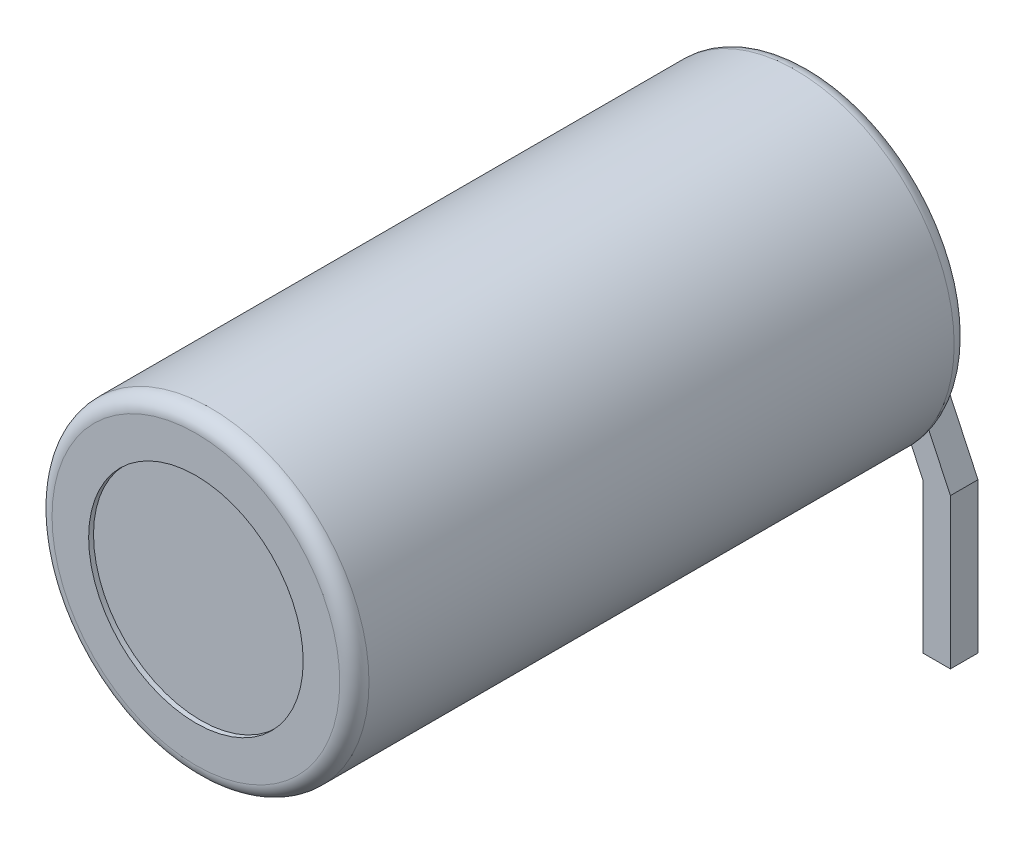
ISO-10303-21;
HEADER;
FILE_DESCRIPTION(('STEP AP214'),'2;1');
FILE_NAME('part.step','',(''),(''),'','','');
FILE_SCHEMA(('AUTOMOTIVE_DESIGN { 1 0 10303 214 1 1 1 1 }'));
ENDSEC;
DATA;
#1=APPLICATION_CONTEXT('core data for automotive mechanical design processes');
#2=APPLICATION_PROTOCOL_DEFINITION('international standard','automotive_design',2000,#1);
#3=PRODUCT_CONTEXT('',#1,'mechanical');
#4=PRODUCT('Part','Part','',(#3));
#5=PRODUCT_RELATED_PRODUCT_CATEGORY('part','',(#4));
#6=PRODUCT_DEFINITION_FORMATION('','',#4);
#7=PRODUCT_DEFINITION_CONTEXT('part definition',#1,'design');
#8=PRODUCT_DEFINITION('design','',#6,#7);
#9=PRODUCT_DEFINITION_SHAPE('','',#8);
#10=(LENGTH_UNIT() NAMED_UNIT(*) SI_UNIT(.MILLI.,.METRE.));
#11=(NAMED_UNIT(*) PLANE_ANGLE_UNIT() SI_UNIT($,.RADIAN.));
#12=(NAMED_UNIT(*) SI_UNIT($,.STERADIAN.) SOLID_ANGLE_UNIT());
#13=UNCERTAINTY_MEASURE_WITH_UNIT(LENGTH_MEASURE(1.E-05),#10,'distance_accuracy_value','');
#14=(GEOMETRIC_REPRESENTATION_CONTEXT(3) GLOBAL_UNCERTAINTY_ASSIGNED_CONTEXT((#13)) GLOBAL_UNIT_ASSIGNED_CONTEXT((#10,
#11,#12)) REPRESENTATION_CONTEXT('',''));
#15=CARTESIAN_POINT('',(0.,0.,0.));
#16=DIRECTION('',(0.,0.,1.));
#17=DIRECTION('',(1.,0.,0.));
#18=AXIS2_PLACEMENT_3D('',#15,#16,#17);
#19=CARTESIAN_POINT('',(-1.217,2.5,-7.71644487630317));
#20=DIRECTION('',(0.,1.,0.));
#21=DIRECTION('',(-1.,0.,0.));
#22=AXIS2_PLACEMENT_3D('',#19,#20,#21);
#23=PLANE('',#22);
#24=DIRECTION('',(-1.,0.,0.));
#25=VECTOR('',#24,1.);
#26=CARTESIAN_POINT('',(0.,2.5,-6.35));
#27=LINE('',#26,#25);
#28=CARTESIAN_POINT('',(-1.217,2.5,-6.35));
#29=VERTEX_POINT('',#28);
#30=CARTESIAN_POINT('',(-1.783,2.5,-6.35));
#31=VERTEX_POINT('',#30);
#32=EDGE_CURVE('E226',#29,#31,#27,.T.);
#33=ORIENTED_EDGE('',*,*,#32,.F.);
#34=DIRECTION('',(0.,0.,1.));
#35=VECTOR('',#34,1.);
#36=CARTESIAN_POINT('',(-1.217,2.5,-7.71644487630317));
#37=LINE('',#36,#35);
#38=CARTESIAN_POINT('',(-1.217,2.5,-6.2));
#39=VERTEX_POINT('',#38);
#40=EDGE_CURVE('E242',#29,#39,#37,.T.);
#41=ORIENTED_EDGE('',*,*,#40,.T.);
#42=DIRECTION('',(-1.,0.,0.));
#43=VECTOR('',#42,1.);
#44=CARTESIAN_POINT('',(-1.217,2.5,-6.2));
#45=LINE('',#44,#43);
#46=CARTESIAN_POINT('',(-1.783,2.5,-6.2));
#47=VERTEX_POINT('',#46);
#48=EDGE_CURVE('E234',#39,#47,#45,.T.);
#49=ORIENTED_EDGE('',*,*,#48,.T.);
#50=DIRECTION('',(0.,0.,1.));
#51=VECTOR('',#50,1.);
#52=CARTESIAN_POINT('',(-1.783,2.5,-7.71644487630317));
#53=LINE('',#52,#51);
#54=EDGE_CURVE('E209',#31,#47,#53,.T.);
#55=ORIENTED_EDGE('',*,*,#54,.F.);
#56=EDGE_LOOP('',(#33,#41,#49,#55));
#57=FACE_BOUND('',#56,.T.);
#58=ADVANCED_FACE('F46',(#57),#23,.F.);
#59=CARTESIAN_POINT('',(0.,0.,-6.2));
#60=DIRECTION('',(0.,0.,1.));
#61=DIRECTION('',(1.,0.,0.));
#62=AXIS2_PLACEMENT_3D('',#59,#60,#61);
#63=PLANE('',#62);
#64=DIRECTION('',(0.,1.,0.));
#65=VECTOR('',#64,1.);
#66=CARTESIAN_POINT('',(1.217,3.066,-6.2));
#67=LINE('',#66,#65);
#68=CARTESIAN_POINT('',(1.217,2.5,-6.2));
#69=VERTEX_POINT('',#68);
#70=CARTESIAN_POINT('',(1.217,3.066,-6.2));
#71=VERTEX_POINT('',#70);
#72=EDGE_CURVE('E306',#69,#71,#67,.T.);
#73=ORIENTED_EDGE('',*,*,#72,.F.);
#74=DIRECTION('',(-1.,0.,0.));
#75=VECTOR('',#74,1.);
#76=CARTESIAN_POINT('',(1.783,2.5,-6.2));
#77=LINE('',#76,#75);
#78=CARTESIAN_POINT('',(1.783,2.5,-6.2));
#79=VERTEX_POINT('',#78);
#80=EDGE_CURVE('E292',#79,#69,#77,.T.);
#81=ORIENTED_EDGE('',*,*,#80,.F.);
#82=DIRECTION('',(0.,-1.,0.));
#83=VECTOR('',#82,1.);
#84=CARTESIAN_POINT('',(1.783,3.066,-6.2));
#85=LINE('',#84,#83);
#86=CARTESIAN_POINT('',(1.783,3.066,-6.2));
#87=VERTEX_POINT('',#86);
#88=EDGE_CURVE('E297',#87,#79,#85,.T.);
#89=ORIENTED_EDGE('',*,*,#88,.F.);
#90=DIRECTION('',(1.,0.,0.));
#91=VECTOR('',#90,1.);
#92=CARTESIAN_POINT('',(1.783,3.066,-6.2));
#93=LINE('',#92,#91);
#94=EDGE_CURVE('E302',#71,#87,#93,.T.);
#95=ORIENTED_EDGE('',*,*,#94,.F.);
#96=EDGE_LOOP('',(#73,#81,#89,#95));
#97=FACE_BOUND('',#96,.T.);
#98=CARTESIAN_POINT('',(0.,3.35,-6.2));
#99=DIRECTION('',(0.,0.,1.));
#100=DIRECTION('',(1.,0.,0.));
#101=AXIS2_PLACEMENT_3D('',#98,#99,#100);
#102=CIRCLE('',#101,2.95);
#103=CARTESIAN_POINT('',(2.95,3.35,-6.2));
#104=VERTEX_POINT('',#103);
#105=EDGE_CURVE('E331',#104,#104,#102,.T.);
#106=ORIENTED_EDGE('',*,*,#105,.F.);
#107=EDGE_LOOP('',(#106));
#108=FACE_BOUND('',#107,.T.);
#109=DIRECTION('',(0.,1.,0.));
#110=VECTOR('',#109,1.);
#111=CARTESIAN_POINT('',(-1.783,3.066,-6.2));
#112=LINE('',#111,#110);
#113=CARTESIAN_POINT('',(-1.783,3.066,-6.2));
#114=VERTEX_POINT('',#113);
#115=EDGE_CURVE('E248',#47,#114,#112,.T.);
#116=ORIENTED_EDGE('',*,*,#115,.F.);
#117=ORIENTED_EDGE('',*,*,#48,.F.);
#118=DIRECTION('',(0.,-1.,0.));
#119=VECTOR('',#118,1.);
#120=CARTESIAN_POINT('',(-1.217,3.066,-6.2));
#121=LINE('',#120,#119);
#122=CARTESIAN_POINT('',(-1.217,3.066,-6.2));
#123=VERTEX_POINT('',#122);
#124=EDGE_CURVE('E239',#123,#39,#121,.T.);
#125=ORIENTED_EDGE('',*,*,#124,.F.);
#126=DIRECTION('',(1.,0.,0.));
#127=VECTOR('',#126,1.);
#128=CARTESIAN_POINT('',(-1.217,3.066,-6.2));
#129=LINE('',#128,#127);
#130=EDGE_CURVE('E244',#114,#123,#129,.T.);
#131=ORIENTED_EDGE('',*,*,#130,.F.);
#132=EDGE_LOOP('',(#116,#117,#125,#131));
#133=FACE_BOUND('',#132,.T.);
#134=ADVANCED_FACE('F419',(#97,#108,#133),#63,.F.);
#135=CARTESIAN_POINT('',(1.783,2.5,-7.71644487630317));
#136=DIRECTION('',(0.,1.,0.));
#137=DIRECTION('',(-1.,0.,0.));
#138=AXIS2_PLACEMENT_3D('',#135,#136,#137);
#139=PLANE('',#138);
#140=DIRECTION('',(1.,0.,0.));
#141=VECTOR('',#140,1.);
#142=CARTESIAN_POINT('',(0.,2.5,-6.35));
#143=LINE('',#142,#141);
#144=CARTESIAN_POINT('',(1.217,2.5,-6.35));
#145=VERTEX_POINT('',#144);
#146=CARTESIAN_POINT('',(1.783,2.5,-6.35));
#147=VERTEX_POINT('',#146);
#148=EDGE_CURVE('E268',#145,#147,#143,.T.);
#149=ORIENTED_EDGE('',*,*,#148,.T.);
#150=DIRECTION('',(0.,0.,1.));
#151=VECTOR('',#150,1.);
#152=CARTESIAN_POINT('',(1.783,2.5,-7.71644487630317));
#153=LINE('',#152,#151);
#154=EDGE_CURVE('E300',#147,#79,#153,.T.);
#155=ORIENTED_EDGE('',*,*,#154,.T.);
#156=ORIENTED_EDGE('',*,*,#80,.T.);
#157=DIRECTION('',(0.,0.,1.));
#158=VECTOR('',#157,1.);
#159=CARTESIAN_POINT('',(1.217,2.5,-7.71644487630317));
#160=LINE('',#159,#158);
#161=EDGE_CURVE('E291',#145,#69,#160,.T.);
#162=ORIENTED_EDGE('',*,*,#161,.F.);
#163=EDGE_LOOP('',(#149,#155,#156,#162));
#164=FACE_BOUND('',#163,.T.);
#165=ADVANCED_FACE('F425',(#164),#139,.F.);
#166=CARTESIAN_POINT('',(0.,3.35,8.51058328321347));
#167=DIRECTION('',(0.,0.,1.));
#168=DIRECTION('',(1.,0.,0.));
#169=AXIS2_PLACEMENT_3D('',#166,#167,#168);
#170=CYLINDRICAL_SURFACE('',#169,3.15);
#171=CARTESIAN_POINT('',(0.,3.35,-6.));
#172=DIRECTION('',(0.,0.,1.));
#173=DIRECTION('',(1.,0.,0.));
#174=AXIS2_PLACEMENT_3D('',#171,#172,#173);
#175=CIRCLE('',#174,3.15);
#176=CARTESIAN_POINT('',(3.15,3.35,-6.));
#177=VERTEX_POINT('',#176);
#178=EDGE_CURVE('E334',#177,#177,#175,.T.);
#179=ORIENTED_EDGE('',*,*,#178,.T.);
#180=EDGE_LOOP('',(#179));
#181=FACE_BOUND('',#180,.T.);
#182=CARTESIAN_POINT('',(0.,3.35,6.));
#183=DIRECTION('',(0.,0.,1.));
#184=DIRECTION('',(1.,0.,0.));
#185=AXIS2_PLACEMENT_3D('',#182,#183,#184);
#186=CIRCLE('',#185,3.15);
#187=CARTESIAN_POINT('',(3.15,3.35,6.));
#188=VERTEX_POINT('',#187);
#189=EDGE_CURVE('E313',#188,#188,#186,.T.);
#190=ORIENTED_EDGE('',*,*,#189,.F.);
#191=EDGE_LOOP('',(#190));
#192=FACE_BOUND('',#191,.T.);
#193=ADVANCED_FACE('F471',(#181,#192),#170,.T.);
#194=CARTESIAN_POINT('',(0.,3.35,-6.));
#195=DIRECTION('',(0.,0.,1.));
#196=DIRECTION('',(1.,0.,0.));
#197=AXIS2_PLACEMENT_3D('',#194,#195,#196);
#198=TOROIDAL_SURFACE('',#197,2.95,0.2);
#199=ORIENTED_EDGE('',*,*,#105,.T.);
#200=EDGE_LOOP('',(#199));
#201=FACE_BOUND('',#200,.T.);
#202=ORIENTED_EDGE('',*,*,#178,.F.);
#203=EDGE_LOOP('',(#202));
#204=FACE_BOUND('',#203,.T.);
#205=ADVANCED_FACE('F494',(#201,#204),#198,.T.);
#206=CARTESIAN_POINT('',(0.,0.,6.2));
#207=DIRECTION('',(0.,0.,1.));
#208=DIRECTION('',(1.,0.,0.));
#209=AXIS2_PLACEMENT_3D('',#206,#207,#208);
#210=PLANE('',#209);
#211=CARTESIAN_POINT('',(0.,3.35,6.2));
#212=DIRECTION('',(0.,0.,1.));
#213=DIRECTION('',(1.,0.,0.));
#214=AXIS2_PLACEMENT_3D('',#211,#212,#213);
#215=CIRCLE('',#214,2.95);
#216=CARTESIAN_POINT('',(2.95,3.35,6.2));
#217=VERTEX_POINT('',#216);
#218=EDGE_CURVE('E328',#217,#217,#215,.T.);
#219=ORIENTED_EDGE('',*,*,#218,.T.);
#220=EDGE_LOOP('',(#219));
#221=FACE_BOUND('',#220,.T.);
#222=ADVANCED_FACE('F491',(#221),#210,.T.);
#223=CARTESIAN_POINT('',(0.,3.35,6.));
#224=DIRECTION('',(0.,0.,1.));
#225=DIRECTION('',(1.,0.,0.));
#226=AXIS2_PLACEMENT_3D('',#223,#224,#225);
#227=TOROIDAL_SURFACE('',#226,2.95,0.2);
#228=ORIENTED_EDGE('',*,*,#218,.F.);
#229=EDGE_LOOP('',(#228));
#230=FACE_BOUND('',#229,.T.);
#231=ORIENTED_EDGE('',*,*,#189,.T.);
#232=EDGE_LOOP('',(#231));
#233=FACE_BOUND('',#232,.T.);
#234=ADVANCED_FACE('F484',(#230,#233),#227,.T.);
#235=CARTESIAN_POINT('',(1.217,3.066,-7.71644487630317));
#236=DIRECTION('',(1.,0.,0.));
#237=DIRECTION('',(0.,0.,-1.));
#238=AXIS2_PLACEMENT_3D('',#235,#236,#237);
#239=PLANE('',#238);
#240=DIRECTION('',(0.,1.,0.));
#241=VECTOR('',#240,1.);
#242=CARTESIAN_POINT('',(1.217,3.066,-6.916));
#243=LINE('',#242,#241);
#244=CARTESIAN_POINT('',(1.217,2.5,-6.916));
#245=VERTEX_POINT('',#244);
#246=CARTESIAN_POINT('',(1.217,3.066,-6.916));
#247=VERTEX_POINT('',#246);
#248=EDGE_CURVE('E295',#245,#247,#243,.T.);
#249=ORIENTED_EDGE('',*,*,#248,.F.);
#250=EDGE_CURVE('E309',#245,#145,#160,.T.);
#251=ORIENTED_EDGE('',*,*,#250,.T.);
#252=ORIENTED_EDGE('',*,*,#161,.T.);
#253=ORIENTED_EDGE('',*,*,#72,.T.);
#254=DIRECTION('',(0.,0.,1.));
#255=VECTOR('',#254,1.);
#256=CARTESIAN_POINT('',(1.217,3.066,-7.71644487630317));
#257=LINE('',#256,#255);
#258=EDGE_CURVE('E305',#247,#71,#257,.T.);
#259=ORIENTED_EDGE('',*,*,#258,.F.);
#260=EDGE_LOOP('',(#249,#251,#252,#253,#259));
#261=FACE_BOUND('',#260,.T.);
#262=ADVANCED_FACE('F480',(#261),#239,.F.);
#263=CARTESIAN_POINT('',(1.783,3.066,-7.71644487630317));
#264=DIRECTION('',(0.,-1.,0.));
#265=DIRECTION('',(0.,0.,-1.));
#266=AXIS2_PLACEMENT_3D('',#263,#264,#265);
#267=PLANE('',#266);
#268=DIRECTION('',(1.,0.,0.));
#269=VECTOR('',#268,1.);
#270=CARTESIAN_POINT('',(1.783,3.066,-6.916));
#271=LINE('',#270,#269);
#272=CARTESIAN_POINT('',(1.783,3.066,-6.916));
#273=VERTEX_POINT('',#272);
#274=EDGE_CURVE('E314',#247,#273,#271,.T.);
#275=ORIENTED_EDGE('',*,*,#274,.F.);
#276=ORIENTED_EDGE('',*,*,#258,.T.);
#277=ORIENTED_EDGE('',*,*,#94,.T.);
#278=DIRECTION('',(0.,0.,1.));
#279=VECTOR('',#278,1.);
#280=CARTESIAN_POINT('',(1.783,3.066,-7.71644487630317));
#281=LINE('',#280,#279);
#282=EDGE_CURVE('E301',#273,#87,#281,.T.);
#283=ORIENTED_EDGE('',*,*,#282,.F.);
#284=EDGE_LOOP('',(#275,#276,#277,#283));
#285=FACE_BOUND('',#284,.T.);
#286=ADVANCED_FACE('F476',(#285),#267,.F.);
#287=CARTESIAN_POINT('',(1.783,3.066,-7.71644487630317));
#288=DIRECTION('',(-1.,0.,0.));
#289=DIRECTION('',(0.,0.,1.));
#290=AXIS2_PLACEMENT_3D('',#287,#288,#289);
#291=PLANE('',#290);
#292=DIRECTION('',(0.,-1.,0.));
#293=VECTOR('',#292,1.);
#294=CARTESIAN_POINT('',(1.783,3.066,-6.916));
#295=LINE('',#294,#293);
#296=CARTESIAN_POINT('',(1.783,2.5,-6.916));
#297=VERTEX_POINT('',#296);
#298=EDGE_CURVE('E310',#273,#297,#295,.T.);
#299=ORIENTED_EDGE('',*,*,#298,.F.);
#300=ORIENTED_EDGE('',*,*,#282,.T.);
#301=ORIENTED_EDGE('',*,*,#88,.T.);
#302=ORIENTED_EDGE('',*,*,#154,.F.);
#303=EDGE_CURVE('E296',#297,#147,#153,.T.);
#304=ORIENTED_EDGE('',*,*,#303,.F.);
#305=EDGE_LOOP('',(#299,#300,#301,#302,#304));
#306=FACE_BOUND('',#305,.T.);
#307=ADVANCED_FACE('F473',(#306),#291,.F.);
#308=CARTESIAN_POINT('',(0.,0.,-6.916));
#309=DIRECTION('',(0.,0.,-1.));
#310=DIRECTION('',(-1.,0.,0.));
#311=AXIS2_PLACEMENT_3D('',#308,#309,#310);
#312=PLANE('',#311);
#313=DIRECTION('',(0.,1.,0.));
#314=VECTOR('',#313,1.);
#315=CARTESIAN_POINT('',(2.823,0.,-6.916));
#316=LINE('',#315,#314);
#317=CARTESIAN_POINT('',(2.823,-2.8,-6.916));
#318=VERTEX_POINT('',#317);
#319=CARTESIAN_POINT('',(2.823,0.278543307086614,-6.916));
#320=VERTEX_POINT('',#319);
#321=EDGE_CURVE('E267',#318,#320,#316,.T.);
#322=ORIENTED_EDGE('',*,*,#321,.F.);
#323=DIRECTION('',(-1.,0.,0.));
#324=VECTOR('',#323,1.);
#325=CARTESIAN_POINT('',(2.257,-2.8,-6.916));
#326=LINE('',#325,#324);
#327=CARTESIAN_POINT('',(2.257,-2.8,-6.916));
#328=VERTEX_POINT('',#327);
#329=EDGE_CURVE('E349',#318,#328,#326,.T.);
#330=ORIENTED_EDGE('',*,*,#329,.T.);
#331=DIRECTION('',(0.,1.,0.));
#332=VECTOR('',#331,1.);
#333=CARTESIAN_POINT('',(2.257,0.,-6.916));
#334=LINE('',#333,#332);
#335=CARTESIAN_POINT('',(2.257,0.278543307086616,-6.916));
#336=VERTEX_POINT('',#335);
#337=EDGE_CURVE('E270',#328,#336,#334,.T.);
#338=ORIENTED_EDGE('',*,*,#337,.T.);
#339=DIRECTION('',(-0.423996691128716,0.905663737770206,0.));
#340=VECTOR('',#339,1.);
#341=CARTESIAN_POINT('',(1.95821209301936,0.916759072205575,-6.916));
#342=LINE('',#341,#340);
#343=EDGE_CURVE('E272',#336,#245,#342,.T.);
#344=ORIENTED_EDGE('',*,*,#343,.T.);
#345=ORIENTED_EDGE('',*,*,#248,.T.);
#346=ORIENTED_EDGE('',*,*,#274,.T.);
#347=ORIENTED_EDGE('',*,*,#298,.T.);
#348=DIRECTION('',(-0.423996691128715,0.905663737770206,0.));
#349=VECTOR('',#348,1.);
#350=CARTESIAN_POINT('',(2.4224604651655,1.13410218250442,-6.916));
#351=LINE('',#350,#349);
#352=EDGE_CURVE('E265',#320,#297,#351,.T.);
#353=ORIENTED_EDGE('',*,*,#352,.F.);
#354=EDGE_LOOP('',(#322,#330,#338,#344,#345,#346,#347,#353));
#355=FACE_BOUND('',#354,.T.);
#356=ADVANCED_FACE('F467',(#355),#312,.T.);
#357=CARTESIAN_POINT('',(2.4224604651655,1.13410218250442,-6.916));
#358=DIRECTION('',(0.905663737770206,0.423996691128715,0.));
#359=DIRECTION('',(-0.423996691128715,0.905663737770206,0.));
#360=AXIS2_PLACEMENT_3D('',#357,#358,#359);
#361=PLANE('',#360);
#362=DIRECTION('',(-0.423996691128715,0.905663737770206,0.));
#363=VECTOR('',#362,1.);
#364=CARTESIAN_POINT('',(2.4224604651655,1.13410218250442,-6.35));
#365=LINE('',#364,#363);
#366=CARTESIAN_POINT('',(2.823,0.278543307086614,-6.35));
#367=VERTEX_POINT('',#366);
#368=EDGE_CURVE('E254',#367,#147,#365,.T.);
#369=ORIENTED_EDGE('',*,*,#368,.F.);
#370=DIRECTION('',(0.,0.,1.));
#371=VECTOR('',#370,1.);
#372=CARTESIAN_POINT('',(2.823,0.278543307086614,-6.916));
#373=LINE('',#372,#371);
#374=EDGE_CURVE('E288',#320,#367,#373,.T.);
#375=ORIENTED_EDGE('',*,*,#374,.F.);
#376=ORIENTED_EDGE('',*,*,#352,.T.);
#377=ORIENTED_EDGE('',*,*,#303,.T.);
#378=EDGE_LOOP('',(#369,#375,#376,#377));
#379=FACE_BOUND('',#378,.T.);
#380=ADVANCED_FACE('F463',(#379),#361,.T.);
#381=CARTESIAN_POINT('',(2.823,0.,-6.916));
#382=DIRECTION('',(1.,0.,0.));
#383=DIRECTION('',(0.,1.,0.));
#384=AXIS2_PLACEMENT_3D('',#381,#382,#383);
#385=PLANE('',#384);
#386=DIRECTION('',(0.,1.,0.));
#387=VECTOR('',#386,1.);
#388=CARTESIAN_POINT('',(2.823,0.,-6.35));
#389=LINE('',#388,#387);
#390=CARTESIAN_POINT('',(2.823,-2.8,-6.35));
#391=VERTEX_POINT('',#390);
#392=EDGE_CURVE('E278',#391,#367,#389,.T.);
#393=ORIENTED_EDGE('',*,*,#392,.F.);
#394=DIRECTION('',(0.,0.,-1.));
#395=VECTOR('',#394,1.);
#396=CARTESIAN_POINT('',(2.823,-2.8,-6.916));
#397=LINE('',#396,#395);
#398=EDGE_CURVE('E346',#391,#318,#397,.T.);
#399=ORIENTED_EDGE('',*,*,#398,.T.);
#400=ORIENTED_EDGE('',*,*,#321,.T.);
#401=ORIENTED_EDGE('',*,*,#374,.T.);
#402=EDGE_LOOP('',(#393,#399,#400,#401));
#403=FACE_BOUND('',#402,.T.);
#404=ADVANCED_FACE('F459',(#403),#385,.T.);
#405=CARTESIAN_POINT('',(0.,-3.,-6.916));
#406=DIRECTION('',(0.,1.,0.));
#407=DIRECTION('',(0.,0.,1.));
#408=AXIS2_PLACEMENT_3D('',#405,#406,#407);
#409=PLANE('',#408);
#410=DIRECTION('',(1.,0.,0.));
#411=VECTOR('',#410,1.);
#412=CARTESIAN_POINT('',(2.823,-3.,-6.716));
#413=LINE('',#412,#411);
#414=CARTESIAN_POINT('',(2.457,-3.,-6.716));
#415=VERTEX_POINT('',#414);
#416=CARTESIAN_POINT('',(2.623,-3.,-6.716));
#417=VERTEX_POINT('',#416);
#418=EDGE_CURVE('E341',#415,#417,#413,.T.);
#419=ORIENTED_EDGE('',*,*,#418,.T.);
#420=DIRECTION('',(0.,0.,1.));
#421=VECTOR('',#420,1.);
#422=CARTESIAN_POINT('',(2.623,-3.,-6.35));
#423=LINE('',#422,#421);
#424=CARTESIAN_POINT('',(2.623,-3.,-6.55));
#425=VERTEX_POINT('',#424);
#426=EDGE_CURVE('E343',#417,#425,#423,.T.);
#427=ORIENTED_EDGE('',*,*,#426,.T.);
#428=DIRECTION('',(-1.,0.,0.));
#429=VECTOR('',#428,1.);
#430=CARTESIAN_POINT('',(0.,-3.,-6.55));
#431=LINE('',#430,#429);
#432=CARTESIAN_POINT('',(2.457,-3.,-6.55));
#433=VERTEX_POINT('',#432);
#434=EDGE_CURVE('E337',#425,#433,#431,.T.);
#435=ORIENTED_EDGE('',*,*,#434,.T.);
#436=DIRECTION('',(0.,0.,-1.));
#437=VECTOR('',#436,1.);
#438=CARTESIAN_POINT('',(2.457,-3.,-6.916));
#439=LINE('',#438,#437);
#440=EDGE_CURVE('E339',#433,#415,#439,.T.);
#441=ORIENTED_EDGE('',*,*,#440,.T.);
#442=EDGE_LOOP('',(#419,#427,#435,#441));
#443=FACE_BOUND('',#442,.T.);
#444=ADVANCED_FACE('F455',(#443),#409,.F.);
#445=CARTESIAN_POINT('',(2.257,0.,-6.916));
#446=DIRECTION('',(1.,0.,0.));
#447=DIRECTION('',(0.,0.,-1.));
#448=AXIS2_PLACEMENT_3D('',#445,#446,#447);
#449=PLANE('',#448);
#450=ORIENTED_EDGE('',*,*,#337,.F.);
#451=DIRECTION('',(0.,0.,1.));
#452=VECTOR('',#451,1.);
#453=CARTESIAN_POINT('',(2.257,-2.8,-6.916));
#454=LINE('',#453,#452);
#455=CARTESIAN_POINT('',(2.257,-2.8,-6.35));
#456=VERTEX_POINT('',#455);
#457=EDGE_CURVE('E351',#328,#456,#454,.T.);
#458=ORIENTED_EDGE('',*,*,#457,.T.);
#459=DIRECTION('',(0.,1.,0.));
#460=VECTOR('',#459,1.);
#461=CARTESIAN_POINT('',(2.257,0.,-6.35));
#462=LINE('',#461,#460);
#463=CARTESIAN_POINT('',(2.257,0.278543307086616,-6.35));
#464=VERTEX_POINT('',#463);
#465=EDGE_CURVE('E280',#456,#464,#462,.T.);
#466=ORIENTED_EDGE('',*,*,#465,.T.);
#467=DIRECTION('',(0.,0.,1.));
#468=VECTOR('',#467,1.);
#469=CARTESIAN_POINT('',(2.257,0.278543307086616,-6.916));
#470=LINE('',#469,#468);
#471=EDGE_CURVE('E275',#336,#464,#470,.T.);
#472=ORIENTED_EDGE('',*,*,#471,.F.);
#473=EDGE_LOOP('',(#450,#458,#466,#472));
#474=FACE_BOUND('',#473,.T.);
#475=ADVANCED_FACE('F451',(#474),#449,.F.);
#476=CARTESIAN_POINT('',(1.95821209301936,0.916759072205575,-6.916));
#477=DIRECTION('',(0.905663737770206,0.423996691128716,0.));
#478=DIRECTION('',(-0.423996691128716,0.905663737770206,0.));
#479=AXIS2_PLACEMENT_3D('',#476,#477,#478);
#480=PLANE('',#479);
#481=DIRECTION('',(-0.423996691128716,0.905663737770206,0.));
#482=VECTOR('',#481,1.);
#483=CARTESIAN_POINT('',(1.95821209301936,0.916759072205575,-6.35));
#484=LINE('',#483,#482);
#485=EDGE_CURVE('E282',#464,#145,#484,.T.);
#486=ORIENTED_EDGE('',*,*,#485,.T.);
#487=ORIENTED_EDGE('',*,*,#250,.F.);
#488=ORIENTED_EDGE('',*,*,#343,.F.);
#489=ORIENTED_EDGE('',*,*,#471,.T.);
#490=EDGE_LOOP('',(#486,#487,#488,#489));
#491=FACE_BOUND('',#490,.T.);
#492=ADVANCED_FACE('F447',(#491),#480,.F.);
#493=CARTESIAN_POINT('',(0.,0.,-6.35));
#494=DIRECTION('',(0.,0.,-1.));
#495=DIRECTION('',(-1.,0.,0.));
#496=AXIS2_PLACEMENT_3D('',#493,#494,#495);
#497=PLANE('',#496);
#498=ORIENTED_EDGE('',*,*,#465,.F.);
#499=DIRECTION('',(1.,0.,0.));
#500=VECTOR('',#499,1.);
#501=CARTESIAN_POINT('',(0.,-2.8,-6.35));
#502=LINE('',#501,#500);
#503=EDGE_CURVE('E353',#456,#391,#502,.T.);
#504=ORIENTED_EDGE('',*,*,#503,.T.);
#505=ORIENTED_EDGE('',*,*,#392,.T.);
#506=ORIENTED_EDGE('',*,*,#368,.T.);
#507=ORIENTED_EDGE('',*,*,#148,.F.);
#508=ORIENTED_EDGE('',*,*,#485,.F.);
#509=EDGE_LOOP('',(#498,#504,#505,#506,#507,#508));
#510=FACE_BOUND('',#509,.T.);
#511=ADVANCED_FACE('F441',(#510),#497,.F.);
#512=CARTESIAN_POINT('',(-1.783,3.066,-7.71644487630317));
#513=DIRECTION('',(1.,0.,0.));
#514=DIRECTION('',(0.,0.,-1.));
#515=AXIS2_PLACEMENT_3D('',#512,#513,#514);
#516=PLANE('',#515);
#517=DIRECTION('',(0.,1.,0.));
#518=VECTOR('',#517,1.);
#519=CARTESIAN_POINT('',(-1.783,3.066,-6.916));
#520=LINE('',#519,#518);
#521=CARTESIAN_POINT('',(-1.783,2.5,-6.916));
#522=VERTEX_POINT('',#521);
#523=CARTESIAN_POINT('',(-1.783,3.066,-6.916));
#524=VERTEX_POINT('',#523);
#525=EDGE_CURVE('E237',#522,#524,#520,.T.);
#526=ORIENTED_EDGE('',*,*,#525,.F.);
#527=EDGE_CURVE('E214',#522,#31,#53,.T.);
#528=ORIENTED_EDGE('',*,*,#527,.T.);
#529=ORIENTED_EDGE('',*,*,#54,.T.);
#530=ORIENTED_EDGE('',*,*,#115,.T.);
#531=DIRECTION('',(0.,0.,1.));
#532=VECTOR('',#531,1.);
#533=CARTESIAN_POINT('',(-1.783,3.066,-7.71644487630317));
#534=LINE('',#533,#532);
#535=EDGE_CURVE('E247',#524,#114,#534,.T.);
#536=ORIENTED_EDGE('',*,*,#535,.F.);
#537=EDGE_LOOP('',(#526,#528,#529,#530,#536));
#538=FACE_BOUND('',#537,.T.);
#539=ADVANCED_FACE('F437',(#538),#516,.F.);
#540=CARTESIAN_POINT('',(-1.217,3.066,-7.71644487630317));
#541=DIRECTION('',(0.,-1.,0.));
#542=DIRECTION('',(0.,0.,-1.));
#543=AXIS2_PLACEMENT_3D('',#540,#541,#542);
#544=PLANE('',#543);
#545=DIRECTION('',(1.,0.,0.));
#546=VECTOR('',#545,1.);
#547=CARTESIAN_POINT('',(-1.217,3.066,-6.916));
#548=LINE('',#547,#546);
#549=CARTESIAN_POINT('',(-1.217,3.066,-6.916));
#550=VERTEX_POINT('',#549);
#551=EDGE_CURVE('E255',#524,#550,#548,.T.);
#552=ORIENTED_EDGE('',*,*,#551,.F.);
#553=ORIENTED_EDGE('',*,*,#535,.T.);
#554=ORIENTED_EDGE('',*,*,#130,.T.);
#555=DIRECTION('',(0.,0.,1.));
#556=VECTOR('',#555,1.);
#557=CARTESIAN_POINT('',(-1.217,3.066,-7.71644487630317));
#558=LINE('',#557,#556);
#559=EDGE_CURVE('E243',#550,#123,#558,.T.);
#560=ORIENTED_EDGE('',*,*,#559,.F.);
#561=EDGE_LOOP('',(#552,#553,#554,#560));
#562=FACE_BOUND('',#561,.T.);
#563=ADVANCED_FACE('F433',(#562),#544,.F.);
#564=CARTESIAN_POINT('',(-1.217,3.066,-7.71644487630317));
#565=DIRECTION('',(-1.,0.,0.));
#566=DIRECTION('',(0.,-1.,0.));
#567=AXIS2_PLACEMENT_3D('',#564,#565,#566);
#568=PLANE('',#567);
#569=DIRECTION('',(0.,-1.,0.));
#570=VECTOR('',#569,1.);
#571=CARTESIAN_POINT('',(-1.217,3.066,-6.916));
#572=LINE('',#571,#570);
#573=CARTESIAN_POINT('',(-1.217,2.5,-6.916));
#574=VERTEX_POINT('',#573);
#575=EDGE_CURVE('E251',#550,#574,#572,.T.);
#576=ORIENTED_EDGE('',*,*,#575,.F.);
#577=ORIENTED_EDGE('',*,*,#559,.T.);
#578=ORIENTED_EDGE('',*,*,#124,.T.);
#579=ORIENTED_EDGE('',*,*,#40,.F.);
#580=EDGE_CURVE('E238',#574,#29,#37,.T.);
#581=ORIENTED_EDGE('',*,*,#580,.F.);
#582=EDGE_LOOP('',(#576,#577,#578,#579,#581));
#583=FACE_BOUND('',#582,.T.);
#584=ADVANCED_FACE('F430',(#583),#568,.F.);
#585=CARTESIAN_POINT('',(0.,0.,-6.916));
#586=DIRECTION('',(0.,0.,-1.));
#587=DIRECTION('',(-1.,0.,0.));
#588=AXIS2_PLACEMENT_3D('',#585,#586,#587);
#589=PLANE('',#588);
#590=DIRECTION('',(0.,1.,0.));
#591=VECTOR('',#590,1.);
#592=CARTESIAN_POINT('',(-2.257,0.,-6.916));
#593=LINE('',#592,#591);
#594=CARTESIAN_POINT('',(-2.257,-2.8,-6.916));
#595=VERTEX_POINT('',#594);
#596=CARTESIAN_POINT('',(-2.257,0.278543307086617,-6.916));
#597=VERTEX_POINT('',#596);
#598=EDGE_CURVE('E201',#595,#597,#593,.T.);
#599=ORIENTED_EDGE('',*,*,#598,.F.);
#600=DIRECTION('',(-1.,0.,0.));
#601=VECTOR('',#600,1.);
#602=CARTESIAN_POINT('',(-2.823,-2.8,-6.916));
#603=LINE('',#602,#601);
#604=CARTESIAN_POINT('',(-2.823,-2.8,-6.916));
#605=VERTEX_POINT('',#604);
#606=EDGE_CURVE('E70',#595,#605,#603,.T.);
#607=ORIENTED_EDGE('',*,*,#606,.T.);
#608=DIRECTION('',(0.,1.,0.));
#609=VECTOR('',#608,1.);
#610=CARTESIAN_POINT('',(-2.823,0.,-6.916));
#611=LINE('',#610,#609);
#612=CARTESIAN_POINT('',(-2.823,0.278543307086615,-6.916));
#613=VERTEX_POINT('',#612);
#614=EDGE_CURVE('E194',#605,#613,#611,.T.);
#615=ORIENTED_EDGE('',*,*,#614,.T.);
#616=DIRECTION('',(0.423996691128716,0.905663737770206,0.));
#617=VECTOR('',#616,1.);
#618=CARTESIAN_POINT('',(-2.4224604651655,1.13410218250442,-6.916));
#619=LINE('',#618,#617);
#620=EDGE_CURVE('E199',#613,#522,#619,.T.);
#621=ORIENTED_EDGE('',*,*,#620,.T.);
#622=ORIENTED_EDGE('',*,*,#525,.T.);
#623=ORIENTED_EDGE('',*,*,#551,.T.);
#624=ORIENTED_EDGE('',*,*,#575,.T.);
#625=DIRECTION('',(0.423996691128716,0.905663737770206,0.));
#626=VECTOR('',#625,1.);
#627=CARTESIAN_POINT('',(-1.95821209301936,0.916759072205576,-6.916));
#628=LINE('',#627,#626);
#629=EDGE_CURVE('E215',#597,#574,#628,.T.);
#630=ORIENTED_EDGE('',*,*,#629,.F.);
#631=EDGE_LOOP('',(#599,#607,#615,#621,#622,#623,#624,#630));
#632=FACE_BOUND('',#631,.T.);
#633=ADVANCED_FACE('F196',(#632),#589,.T.);
#634=CARTESIAN_POINT('',(-2.257,0.,-6.916));
#635=DIRECTION('',(1.,0.,0.));
#636=DIRECTION('',(0.,0.,-1.));
#637=AXIS2_PLACEMENT_3D('',#634,#635,#636);
#638=PLANE('',#637);
#639=DIRECTION('',(0.,1.,0.));
#640=VECTOR('',#639,1.);
#641=CARTESIAN_POINT('',(-2.257,0.,-6.35));
#642=LINE('',#641,#640);
#643=CARTESIAN_POINT('',(-2.257,-2.8,-6.35));
#644=VERTEX_POINT('',#643);
#645=CARTESIAN_POINT('',(-2.257,0.278543307086617,-6.35));
#646=VERTEX_POINT('',#645);
#647=EDGE_CURVE('E220',#644,#646,#642,.T.);
#648=ORIENTED_EDGE('',*,*,#647,.F.);
#649=DIRECTION('',(0.,0.,-1.));
#650=VECTOR('',#649,1.);
#651=CARTESIAN_POINT('',(-2.257,-2.8,-6.916));
#652=LINE('',#651,#650);
#653=EDGE_CURVE('E364',#644,#595,#652,.T.);
#654=ORIENTED_EDGE('',*,*,#653,.T.);
#655=ORIENTED_EDGE('',*,*,#598,.T.);
#656=DIRECTION('',(0.,0.,1.));
#657=VECTOR('',#656,1.);
#658=CARTESIAN_POINT('',(-2.257,0.278543307086617,-6.916));
#659=LINE('',#658,#657);
#660=EDGE_CURVE('E210',#597,#646,#659,.T.);
#661=ORIENTED_EDGE('',*,*,#660,.T.);
#662=EDGE_LOOP('',(#648,#654,#655,#661));
#663=FACE_BOUND('',#662,.T.);
#664=ADVANCED_FACE('F402',(#663),#638,.T.);
#665=CARTESIAN_POINT('',(0.,-3.,-6.916));
#666=DIRECTION('',(0.,1.,0.));
#667=DIRECTION('',(0.,0.,1.));
#668=AXIS2_PLACEMENT_3D('',#665,#666,#667);
#669=PLANE('',#668);
#670=DIRECTION('',(1.,0.,0.));
#671=VECTOR('',#670,1.);
#672=CARTESIAN_POINT('',(-2.257,-3.,-6.716));
#673=LINE('',#672,#671);
#674=CARTESIAN_POINT('',(-2.623,-3.,-6.716));
#675=VERTEX_POINT('',#674);
#676=CARTESIAN_POINT('',(-2.457,-3.,-6.716));
#677=VERTEX_POINT('',#676);
#678=EDGE_CURVE('E359',#675,#677,#673,.T.);
#679=ORIENTED_EDGE('',*,*,#678,.T.);
#680=DIRECTION('',(0.,0.,1.));
#681=VECTOR('',#680,1.);
#682=CARTESIAN_POINT('',(-2.457,-3.,-6.35));
#683=LINE('',#682,#681);
#684=CARTESIAN_POINT('',(-2.457,-3.,-6.55));
#685=VERTEX_POINT('',#684);
#686=EDGE_CURVE('E361',#677,#685,#683,.T.);
#687=ORIENTED_EDGE('',*,*,#686,.T.);
#688=DIRECTION('',(-1.,0.,0.));
#689=VECTOR('',#688,1.);
#690=CARTESIAN_POINT('',(0.,-3.,-6.55));
#691=LINE('',#690,#689);
#692=CARTESIAN_POINT('',(-2.623,-3.,-6.55));
#693=VERTEX_POINT('',#692);
#694=EDGE_CURVE('E355',#685,#693,#691,.T.);
#695=ORIENTED_EDGE('',*,*,#694,.T.);
#696=DIRECTION('',(0.,0.,-1.));
#697=VECTOR('',#696,1.);
#698=CARTESIAN_POINT('',(-2.623,-3.,-6.916));
#699=LINE('',#698,#697);
#700=EDGE_CURVE('E357',#693,#675,#699,.T.);
#701=ORIENTED_EDGE('',*,*,#700,.T.);
#702=EDGE_LOOP('',(#679,#687,#695,#701));
#703=FACE_BOUND('',#702,.T.);
#704=ADVANCED_FACE('F409',(#703),#669,.F.);
#705=CARTESIAN_POINT('',(-2.823,0.,-6.916));
#706=DIRECTION('',(1.,0.,0.));
#707=DIRECTION('',(0.,1.,0.));
#708=AXIS2_PLACEMENT_3D('',#705,#706,#707);
#709=PLANE('',#708);
#710=ORIENTED_EDGE('',*,*,#614,.F.);
#711=DIRECTION('',(0.,0.,1.));
#712=VECTOR('',#711,1.);
#713=CARTESIAN_POINT('',(-2.823,-2.8,-6.916));
#714=LINE('',#713,#712);
#715=CARTESIAN_POINT('',(-2.823,-2.8,-6.35));
#716=VERTEX_POINT('',#715);
#717=EDGE_CURVE('E55',#605,#716,#714,.T.);
#718=ORIENTED_EDGE('',*,*,#717,.T.);
#719=DIRECTION('',(0.,1.,0.));
#720=VECTOR('',#719,1.);
#721=CARTESIAN_POINT('',(-2.823,0.,-6.35));
#722=LINE('',#721,#720);
#723=CARTESIAN_POINT('',(-2.823,0.278543307086615,-6.35));
#724=VERTEX_POINT('',#723);
#725=EDGE_CURVE('E206',#716,#724,#722,.T.);
#726=ORIENTED_EDGE('',*,*,#725,.T.);
#727=DIRECTION('',(0.,0.,1.));
#728=VECTOR('',#727,1.);
#729=CARTESIAN_POINT('',(-2.823,0.278543307086615,-6.916));
#730=LINE('',#729,#728);
#731=EDGE_CURVE('E204',#613,#724,#730,.T.);
#732=ORIENTED_EDGE('',*,*,#731,.F.);
#733=EDGE_LOOP('',(#710,#718,#726,#732));
#734=FACE_BOUND('',#733,.T.);
#735=ADVANCED_FACE('F205',(#734),#709,.F.);
#736=CARTESIAN_POINT('',(-2.4224604651655,1.13410218250442,-6.916));
#737=DIRECTION('',(0.905663737770206,-0.423996691128716,0.));
#738=DIRECTION('',(0.423996691128716,0.905663737770206,0.));
#739=AXIS2_PLACEMENT_3D('',#736,#737,#738);
#740=PLANE('',#739);
#741=DIRECTION('',(0.423996691128716,0.905663737770206,0.));
#742=VECTOR('',#741,1.);
#743=CARTESIAN_POINT('',(-2.4224604651655,1.13410218250442,-6.35));
#744=LINE('',#743,#742);
#745=EDGE_CURVE('E224',#724,#31,#744,.T.);
#746=ORIENTED_EDGE('',*,*,#745,.T.);
#747=ORIENTED_EDGE('',*,*,#527,.F.);
#748=ORIENTED_EDGE('',*,*,#620,.F.);
#749=ORIENTED_EDGE('',*,*,#731,.T.);
#750=EDGE_LOOP('',(#746,#747,#748,#749));
#751=FACE_BOUND('',#750,.T.);
#752=ADVANCED_FACE('F212',(#751),#740,.F.);
#753=CARTESIAN_POINT('',(-1.95821209301936,0.916759072205576,-6.916));
#754=DIRECTION('',(0.905663737770206,-0.423996691128716,0.));
#755=DIRECTION('',(0.423996691128716,0.905663737770206,0.));
#756=AXIS2_PLACEMENT_3D('',#753,#754,#755);
#757=PLANE('',#756);
#758=DIRECTION('',(0.423996691128716,0.905663737770206,0.));
#759=VECTOR('',#758,1.);
#760=CARTESIAN_POINT('',(-1.95821209301936,0.916759072205576,-6.35));
#761=LINE('',#760,#759);
#762=EDGE_CURVE('E229',#646,#29,#761,.T.);
#763=ORIENTED_EDGE('',*,*,#762,.F.);
#764=ORIENTED_EDGE('',*,*,#660,.F.);
#765=ORIENTED_EDGE('',*,*,#629,.T.);
#766=ORIENTED_EDGE('',*,*,#580,.T.);
#767=EDGE_LOOP('',(#763,#764,#765,#766));
#768=FACE_BOUND('',#767,.T.);
#769=ADVANCED_FACE('F550',(#768),#757,.T.);
#770=CARTESIAN_POINT('',(0.,0.,-6.35));
#771=DIRECTION('',(0.,0.,-1.));
#772=DIRECTION('',(-1.,0.,0.));
#773=AXIS2_PLACEMENT_3D('',#770,#771,#772);
#774=PLANE('',#773);
#775=ORIENTED_EDGE('',*,*,#725,.F.);
#776=DIRECTION('',(1.,0.,0.));
#777=VECTOR('',#776,1.);
#778=CARTESIAN_POINT('',(0.,-2.8,-6.35));
#779=LINE('',#778,#777);
#780=EDGE_CURVE('E12',#716,#644,#779,.T.);
#781=ORIENTED_EDGE('',*,*,#780,.T.);
#782=ORIENTED_EDGE('',*,*,#647,.T.);
#783=ORIENTED_EDGE('',*,*,#762,.T.);
#784=ORIENTED_EDGE('',*,*,#32,.T.);
#785=ORIENTED_EDGE('',*,*,#745,.F.);
#786=EDGE_LOOP('',(#775,#781,#782,#783,#784,#785));
#787=FACE_BOUND('',#786,.T.);
#788=ADVANCED_FACE('F399',(#787),#774,.F.);
#789=CARTESIAN_POINT('',(2.257,-2.8,-6.916));
#790=DIRECTION('',(0.707106781186554,0.707106781186541,0.));
#791=DIRECTION('',(0.,0.,1.));
#792=AXIS2_PLACEMENT_3D('',#789,#790,#791);
#793=PLANE('',#792);
#794=DIRECTION('',(0.577350269189622,-0.577350269189632,-0.577350269189622));
#795=VECTOR('',#794,1.);
#796=CARTESIAN_POINT('',(1.63800000000001,-2.181,-5.73100000000001));
#797=LINE('',#796,#795);
#798=EDGE_CURVE('E373',#456,#433,#797,.T.);
#799=ORIENTED_EDGE('',*,*,#798,.F.);
#800=ORIENTED_EDGE('',*,*,#457,.F.);
#801=DIRECTION('',(-0.577350269189622,0.577350269189632,-0.577350269189622));
#802=VECTOR('',#801,1.);
#803=CARTESIAN_POINT('',(2.257,-2.8,-6.916));
#804=LINE('',#803,#802);
#805=EDGE_CURVE('E222',#415,#328,#804,.T.);
#806=ORIENTED_EDGE('',*,*,#805,.F.);
#807=ORIENTED_EDGE('',*,*,#440,.F.);
#808=EDGE_LOOP('',(#799,#800,#806,#807));
#809=FACE_BOUND('',#808,.T.);
#810=ADVANCED_FACE('F514',(#809),#793,.F.);
#811=CARTESIAN_POINT('',(0.,-2.8,-6.916));
#812=DIRECTION('',(0.,-0.707106781186541,-0.707106781186554));
#813=DIRECTION('',(1.,0.,0.));
#814=AXIS2_PLACEMENT_3D('',#811,#812,#813);
#815=PLANE('',#814);
#816=ORIENTED_EDGE('',*,*,#805,.T.);
#817=ORIENTED_EDGE('',*,*,#329,.F.);
#818=DIRECTION('',(-0.577350269189622,-0.577350269189632,0.577350269189622));
#819=VECTOR('',#818,1.);
#820=CARTESIAN_POINT('',(1.88200000000001,-3.741,-5.97500000000001));
#821=LINE('',#820,#819);
#822=EDGE_CURVE('E371',#417,#318,#821,.F.);
#823=ORIENTED_EDGE('',*,*,#822,.F.);
#824=ORIENTED_EDGE('',*,*,#418,.F.);
#825=EDGE_LOOP('',(#816,#817,#823,#824));
#826=FACE_BOUND('',#825,.T.);
#827=ADVANCED_FACE('F510',(#826),#815,.T.);
#828=CARTESIAN_POINT('',(0.,-3.,-6.55));
#829=DIRECTION('',(0.,0.707106781186541,-0.707106781186554));
#830=DIRECTION('',(-1.,0.,0.));
#831=AXIS2_PLACEMENT_3D('',#828,#829,#830);
#832=PLANE('',#831);
#833=ORIENTED_EDGE('',*,*,#798,.T.);
#834=ORIENTED_EDGE('',*,*,#434,.F.);
#835=DIRECTION('',(-0.577350269189622,-0.577350269189632,-0.577350269189622));
#836=VECTOR('',#835,1.);
#837=CARTESIAN_POINT('',(1.74866666666668,-3.87433333333334,-7.42433333333332));
#838=LINE('',#837,#836);
#839=EDGE_CURVE('E369',#391,#425,#838,.T.);
#840=ORIENTED_EDGE('',*,*,#839,.F.);
#841=ORIENTED_EDGE('',*,*,#503,.F.);
#842=EDGE_LOOP('',(#833,#834,#840,#841));
#843=FACE_BOUND('',#842,.T.);
#844=ADVANCED_FACE('F506',(#843),#832,.F.);
#845=CARTESIAN_POINT('',(2.623,-3.,-6.916));
#846=DIRECTION('',(0.707106781186554,-0.707106781186541,0.));
#847=DIRECTION('',(0.,0.,-1.));
#848=AXIS2_PLACEMENT_3D('',#845,#846,#847);
#849=PLANE('',#848);
#850=ORIENTED_EDGE('',*,*,#822,.T.);
#851=ORIENTED_EDGE('',*,*,#398,.F.);
#852=ORIENTED_EDGE('',*,*,#839,.T.);
#853=ORIENTED_EDGE('',*,*,#426,.F.);
#854=EDGE_LOOP('',(#850,#851,#852,#853));
#855=FACE_BOUND('',#854,.T.);
#856=ADVANCED_FACE('F503',(#855),#849,.T.);
#857=CARTESIAN_POINT('',(-2.823,-2.8,-6.916));
#858=DIRECTION('',(0.707106781186554,0.707106781186541,0.));
#859=DIRECTION('',(0.,0.,1.));
#860=AXIS2_PLACEMENT_3D('',#857,#858,#859);
#861=PLANE('',#860);
#862=DIRECTION('',(0.577350269189622,-0.577350269189632,-0.577350269189622));
#863=VECTOR('',#862,1.);
#864=CARTESIAN_POINT('',(-1.74866666666668,-3.87433333333334,-7.42433333333332));
#865=LINE('',#864,#863);
#866=EDGE_CURVE('E381',#716,#693,#865,.T.);
#867=ORIENTED_EDGE('',*,*,#866,.F.);
#868=ORIENTED_EDGE('',*,*,#717,.F.);
#869=DIRECTION('',(-0.577350269189622,0.577350269189632,-0.577350269189622));
#870=VECTOR('',#869,1.);
#871=CARTESIAN_POINT('',(-2.823,-2.8,-6.916));
#872=LINE('',#871,#870);
#873=EDGE_CURVE('E50',#675,#605,#872,.T.);
#874=ORIENTED_EDGE('',*,*,#873,.F.);
#875=ORIENTED_EDGE('',*,*,#700,.F.);
#876=EDGE_LOOP('',(#867,#868,#874,#875));
#877=FACE_BOUND('',#876,.T.);
#878=ADVANCED_FACE('F48',(#877),#861,.F.);
#879=CARTESIAN_POINT('',(0.,-2.8,-6.916));
#880=DIRECTION('',(0.,-0.707106781186541,-0.707106781186554));
#881=DIRECTION('',(1.,0.,0.));
#882=AXIS2_PLACEMENT_3D('',#879,#880,#881);
#883=PLANE('',#882);
#884=ORIENTED_EDGE('',*,*,#873,.T.);
#885=ORIENTED_EDGE('',*,*,#606,.F.);
#886=DIRECTION('',(-0.577350269189622,-0.577350269189632,0.577350269189622));
#887=VECTOR('',#886,1.);
#888=CARTESIAN_POINT('',(-1.50466666666668,-2.04766666666666,-7.66833333333332));
#889=LINE('',#888,#887);
#890=EDGE_CURVE('E380',#677,#595,#889,.F.);
#891=ORIENTED_EDGE('',*,*,#890,.F.);
#892=ORIENTED_EDGE('',*,*,#678,.F.);
#893=EDGE_LOOP('',(#884,#885,#891,#892));
#894=FACE_BOUND('',#893,.T.);
#895=ADVANCED_FACE('F391',(#894),#883,.T.);
#896=CARTESIAN_POINT('',(0.,-3.,-6.55));
#897=DIRECTION('',(0.,0.707106781186541,-0.707106781186554));
#898=DIRECTION('',(-1.,0.,0.));
#899=AXIS2_PLACEMENT_3D('',#896,#897,#898);
#900=PLANE('',#899);
#901=ORIENTED_EDGE('',*,*,#866,.T.);
#902=ORIENTED_EDGE('',*,*,#694,.F.);
#903=DIRECTION('',(-0.577350269189622,-0.577350269189632,-0.577350269189622));
#904=VECTOR('',#903,1.);
#905=CARTESIAN_POINT('',(-1.63800000000001,-2.181,-5.73100000000001));
#906=LINE('',#905,#904);
#907=EDGE_CURVE('E378',#644,#685,#906,.T.);
#908=ORIENTED_EDGE('',*,*,#907,.F.);
#909=ORIENTED_EDGE('',*,*,#780,.F.);
#910=EDGE_LOOP('',(#901,#902,#908,#909));
#911=FACE_BOUND('',#910,.T.);
#912=ADVANCED_FACE('F396',(#911),#900,.F.);
#913=CARTESIAN_POINT('',(-2.457,-3.,-6.916));
#914=DIRECTION('',(0.707106781186554,-0.707106781186541,0.));
#915=DIRECTION('',(0.,0.,-1.));
#916=AXIS2_PLACEMENT_3D('',#913,#914,#915);
#917=PLANE('',#916);
#918=ORIENTED_EDGE('',*,*,#890,.T.);
#919=ORIENTED_EDGE('',*,*,#653,.F.);
#920=ORIENTED_EDGE('',*,*,#907,.T.);
#921=ORIENTED_EDGE('',*,*,#686,.F.);
#922=EDGE_LOOP('',(#918,#919,#920,#921));
#923=FACE_BOUND('',#922,.T.);
#924=ADVANCED_FACE('F406',(#923),#917,.T.);
#925=CLOSED_SHELL('',(#58,#134,#165,#193,#205,#222,#234,#262,#286,#307,#356,#380,#404,#444,#475,
#492,#511,#539,#563,#584,#633,#664,#704,#735,#752,#769,#788,#810,#827,#844,#856,#878,#895,#912,#924));
#926=MANIFOLD_SOLID_BREP('B2',#925);
#927=CARTESIAN_POINT('',(0.,3.35,-6.));
#928=DIRECTION('',(0.,0.,1.));
#929=DIRECTION('',(1.,0.,0.));
#930=AXIS2_PLACEMENT_3D('',#927,#928,#929);
#931=TOROIDAL_SURFACE('',#930,2.95,0.2);
#932=CARTESIAN_POINT('',(0.,3.35,-6.2));
#933=DIRECTION('',(0.,0.,1.));
#934=DIRECTION('',(1.,0.,0.));
#935=AXIS2_PLACEMENT_3D('',#932,#933,#934);
#936=CIRCLE('',#935,2.95);
#937=CARTESIAN_POINT('',(2.95,3.35,-6.2));
#938=VERTEX_POINT('',#937);
#939=EDGE_CURVE('E837',#938,#938,#936,.T.);
#940=ORIENTED_EDGE('',*,*,#939,.F.);
#941=EDGE_LOOP('',(#940));
#942=FACE_BOUND('',#941,.T.);
#943=CARTESIAN_POINT('',(0.,3.35,-6.));
#944=DIRECTION('',(0.,0.,1.));
#945=DIRECTION('',(1.,0.,0.));
#946=AXIS2_PLACEMENT_3D('',#943,#944,#945);
#947=CIRCLE('',#946,3.15);
#948=CARTESIAN_POINT('',(3.15,3.35,-6.));
#949=VERTEX_POINT('',#948);
#950=EDGE_CURVE('E45',#949,#949,#947,.T.);
#951=ORIENTED_EDGE('',*,*,#950,.T.);
#952=EDGE_LOOP('',(#951));
#953=FACE_BOUND('',#952,.T.);
#954=ADVANCED_FACE('F797',(#942,#953),#931,.F.);
#955=CARTESIAN_POINT('',(0.,3.35,8.51058328321347));
#956=DIRECTION('',(0.,0.,1.));
#957=DIRECTION('',(1.,0.,0.));
#958=AXIS2_PLACEMENT_3D('',#955,#956,#957);
#959=CYLINDRICAL_SURFACE('',#958,3.15);
#960=ORIENTED_EDGE('',*,*,#950,.F.);
#961=EDGE_LOOP('',(#960));
#962=FACE_BOUND('',#961,.T.);
#963=CARTESIAN_POINT('',(0.,3.35,6.));
#964=DIRECTION('',(0.,0.,1.));
#965=DIRECTION('',(1.,0.,0.));
#966=AXIS2_PLACEMENT_3D('',#963,#964,#965);
#967=CIRCLE('',#966,3.15);
#968=CARTESIAN_POINT('',(3.15,3.35,6.));
#969=VERTEX_POINT('',#968);
#970=EDGE_CURVE('E803',#969,#969,#967,.T.);
#971=ORIENTED_EDGE('',*,*,#970,.T.);
#972=EDGE_LOOP('',(#971));
#973=FACE_BOUND('',#972,.T.);
#974=ADVANCED_FACE('F845',(#962,#973),#959,.F.);
#975=CARTESIAN_POINT('',(0.,3.35,6.));
#976=DIRECTION('',(0.,0.,1.));
#977=DIRECTION('',(1.,0.,0.));
#978=AXIS2_PLACEMENT_3D('',#975,#976,#977);
#979=TOROIDAL_SURFACE('',#978,2.95,0.2);
#980=CARTESIAN_POINT('',(0.,3.35,6.2));
#981=DIRECTION('',(0.,0.,1.));
#982=DIRECTION('',(1.,0.,0.));
#983=AXIS2_PLACEMENT_3D('',#980,#981,#982);
#984=CIRCLE('',#983,2.95);
#985=CARTESIAN_POINT('',(2.95,3.35,6.2));
#986=VERTEX_POINT('',#985);
#987=EDGE_CURVE('E807',#986,#986,#984,.T.);
#988=ORIENTED_EDGE('',*,*,#987,.T.);
#989=EDGE_LOOP('',(#988));
#990=FACE_BOUND('',#989,.T.);
#991=ORIENTED_EDGE('',*,*,#970,.F.);
#992=EDGE_LOOP('',(#991));
#993=FACE_BOUND('',#992,.T.);
#994=ADVANCED_FACE('F849',(#990,#993),#979,.F.);
#995=CARTESIAN_POINT('',(0.,0.,6.2));
#996=DIRECTION('',(0.,0.,1.));
#997=DIRECTION('',(1.,0.,0.));
#998=AXIS2_PLACEMENT_3D('',#995,#996,#997);
#999=PLANE('',#998);
#1000=ORIENTED_EDGE('',*,*,#987,.F.);
#1001=EDGE_LOOP('',(#1000));
#1002=FACE_BOUND('',#1001,.T.);
#1003=CARTESIAN_POINT('',(0.,3.35,6.2));
#1004=DIRECTION('',(0.,0.,1.));
#1005=DIRECTION('',(1.,0.,0.));
#1006=AXIS2_PLACEMENT_3D('',#1003,#1004,#1005);
#1007=CIRCLE('',#1006,2.2);
#1008=CARTESIAN_POINT('',(2.2,3.35,6.2));
#1009=VERTEX_POINT('',#1008);
#1010=EDGE_CURVE('E811',#1009,#1009,#1007,.T.);
#1011=ORIENTED_EDGE('',*,*,#1010,.T.);
#1012=EDGE_LOOP('',(#1011));
#1013=FACE_BOUND('',#1012,.T.);
#1014=ADVANCED_FACE('F854',(#1002,#1013),#999,.F.);
#1015=CARTESIAN_POINT('',(0.,3.35,8.51058328321347));
#1016=DIRECTION('',(0.,0.,1.));
#1017=DIRECTION('',(1.,0.,0.));
#1018=AXIS2_PLACEMENT_3D('',#1015,#1016,#1017);
#1019=CYLINDRICAL_SURFACE('',#1018,2.2);
#1020=ORIENTED_EDGE('',*,*,#1010,.F.);
#1021=EDGE_LOOP('',(#1020));
#1022=FACE_BOUND('',#1021,.T.);
#1023=CARTESIAN_POINT('',(0.,3.35,6.3));
#1024=DIRECTION('',(0.,0.,1.));
#1025=DIRECTION('',(1.,0.,0.));
#1026=AXIS2_PLACEMENT_3D('',#1023,#1024,#1025);
#1027=CIRCLE('',#1026,2.2);
#1028=CARTESIAN_POINT('',(2.2,3.35,6.3));
#1029=VERTEX_POINT('',#1028);
#1030=EDGE_CURVE('E816',#1029,#1029,#1027,.T.);
#1031=ORIENTED_EDGE('',*,*,#1030,.T.);
#1032=EDGE_LOOP('',(#1031));
#1033=FACE_BOUND('',#1032,.T.);
#1034=ADVANCED_FACE('F860',(#1022,#1033),#1019,.F.);
#1035=CARTESIAN_POINT('',(0.,0.,6.3));
#1036=DIRECTION('',(0.,0.,1.));
#1037=DIRECTION('',(1.,0.,0.));
#1038=AXIS2_PLACEMENT_3D('',#1035,#1036,#1037);
#1039=PLANE('',#1038);
#1040=CARTESIAN_POINT('',(0.,3.35,6.3));
#1041=DIRECTION('',(0.,0.,1.));
#1042=DIRECTION('',(1.,0.,0.));
#1043=AXIS2_PLACEMENT_3D('',#1040,#1041,#1042);
#1044=CIRCLE('',#1043,2.95);
#1045=CARTESIAN_POINT('',(2.95,3.35,6.3));
#1046=VERTEX_POINT('',#1045);
#1047=EDGE_CURVE('E819',#1046,#1046,#1044,.T.);
#1048=ORIENTED_EDGE('',*,*,#1047,.T.);
#1049=EDGE_LOOP('',(#1048));
#1050=FACE_BOUND('',#1049,.T.);
#1051=ORIENTED_EDGE('',*,*,#1030,.F.);
#1052=EDGE_LOOP('',(#1051));
#1053=FACE_BOUND('',#1052,.T.);
#1054=ADVANCED_FACE('F864',(#1050,#1053),#1039,.T.);
#1055=CARTESIAN_POINT('',(0.,3.35,6.));
#1056=DIRECTION('',(0.,0.,1.));
#1057=DIRECTION('',(1.,0.,0.));
#1058=AXIS2_PLACEMENT_3D('',#1055,#1056,#1057);
#1059=TOROIDAL_SURFACE('',#1058,2.95,0.3);
#1060=ORIENTED_EDGE('',*,*,#1047,.F.);
#1061=EDGE_LOOP('',(#1060));
#1062=FACE_BOUND('',#1061,.T.);
#1063=CARTESIAN_POINT('',(0.,3.35,6.));
#1064=DIRECTION('',(0.,0.,1.));
#1065=DIRECTION('',(1.,0.,0.));
#1066=AXIS2_PLACEMENT_3D('',#1063,#1064,#1065);
#1067=CIRCLE('',#1066,3.25);
#1068=CARTESIAN_POINT('',(3.25,3.35,6.));
#1069=VERTEX_POINT('',#1068);
#1070=EDGE_CURVE('E822',#1069,#1069,#1067,.T.);
#1071=ORIENTED_EDGE('',*,*,#1070,.T.);
#1072=EDGE_LOOP('',(#1071));
#1073=FACE_BOUND('',#1072,.T.);
#1074=ADVANCED_FACE('F868',(#1062,#1073),#1059,.T.);
#1075=CARTESIAN_POINT('',(0.,3.35,8.51058328321347));
#1076=DIRECTION('',(0.,0.,1.));
#1077=DIRECTION('',(1.,0.,0.));
#1078=AXIS2_PLACEMENT_3D('',#1075,#1076,#1077);
#1079=CYLINDRICAL_SURFACE('',#1078,3.25);
#1080=CARTESIAN_POINT('',(0.,3.35,-6.));
#1081=DIRECTION('',(0.,0.,1.));
#1082=DIRECTION('',(1.,0.,0.));
#1083=AXIS2_PLACEMENT_3D('',#1080,#1081,#1082);
#1084=CIRCLE('',#1083,3.25);
#1085=CARTESIAN_POINT('',(3.25,3.35,-6.));
#1086=VERTEX_POINT('',#1085);
#1087=EDGE_CURVE('E825',#1086,#1086,#1084,.T.);
#1088=ORIENTED_EDGE('',*,*,#1087,.T.);
#1089=EDGE_LOOP('',(#1088));
#1090=FACE_BOUND('',#1089,.T.);
#1091=ORIENTED_EDGE('',*,*,#1070,.F.);
#1092=EDGE_LOOP('',(#1091));
#1093=FACE_BOUND('',#1092,.T.);
#1094=ADVANCED_FACE('F872',(#1090,#1093),#1079,.T.);
#1095=CARTESIAN_POINT('',(0.,3.35,-6.));
#1096=DIRECTION('',(0.,0.,1.));
#1097=DIRECTION('',(1.,0.,0.));
#1098=AXIS2_PLACEMENT_3D('',#1095,#1096,#1097);
#1099=TOROIDAL_SURFACE('',#1098,2.95,0.3);
#1100=CARTESIAN_POINT('',(0.,3.35,-6.3));
#1101=DIRECTION('',(0.,0.,1.));
#1102=DIRECTION('',(1.,0.,0.));
#1103=AXIS2_PLACEMENT_3D('',#1100,#1101,#1102);
#1104=CIRCLE('',#1103,2.95);
#1105=CARTESIAN_POINT('',(2.95,3.35,-6.3));
#1106=VERTEX_POINT('',#1105);
#1107=EDGE_CURVE('E828',#1106,#1106,#1104,.T.);
#1108=ORIENTED_EDGE('',*,*,#1107,.T.);
#1109=EDGE_LOOP('',(#1108));
#1110=FACE_BOUND('',#1109,.T.);
#1111=ORIENTED_EDGE('',*,*,#1087,.F.);
#1112=EDGE_LOOP('',(#1111));
#1113=FACE_BOUND('',#1112,.T.);
#1114=ADVANCED_FACE('F876',(#1110,#1113),#1099,.T.);
#1115=CARTESIAN_POINT('',(0.,0.,-6.3));
#1116=DIRECTION('',(0.,0.,1.));
#1117=DIRECTION('',(1.,0.,0.));
#1118=AXIS2_PLACEMENT_3D('',#1115,#1116,#1117);
#1119=PLANE('',#1118);
#1120=ORIENTED_EDGE('',*,*,#1107,.F.);
#1121=EDGE_LOOP('',(#1120));
#1122=FACE_BOUND('',#1121,.T.);
#1123=CARTESIAN_POINT('',(0.,3.35,-6.3));
#1124=DIRECTION('',(0.,0.,1.));
#1125=DIRECTION('',(1.,0.,0.));
#1126=AXIS2_PLACEMENT_3D('',#1123,#1124,#1125);
#1127=CIRCLE('',#1126,2.2);
#1128=CARTESIAN_POINT('',(2.2,3.35,-6.3));
#1129=VERTEX_POINT('',#1128);
#1130=EDGE_CURVE('E831',#1129,#1129,#1127,.T.);
#1131=ORIENTED_EDGE('',*,*,#1130,.T.);
#1132=EDGE_LOOP('',(#1131));
#1133=FACE_BOUND('',#1132,.T.);
#1134=ADVANCED_FACE('F880',(#1122,#1133),#1119,.F.);
#1135=CARTESIAN_POINT('',(0.,3.35,8.51058328321347));
#1136=DIRECTION('',(0.,0.,1.));
#1137=DIRECTION('',(1.,0.,0.));
#1138=AXIS2_PLACEMENT_3D('',#1135,#1136,#1137);
#1139=CYLINDRICAL_SURFACE('',#1138,2.2);
#1140=CARTESIAN_POINT('',(0.,3.35,-6.2));
#1141=DIRECTION('',(0.,0.,1.));
#1142=DIRECTION('',(1.,0.,0.));
#1143=AXIS2_PLACEMENT_3D('',#1140,#1141,#1142);
#1144=CIRCLE('',#1143,2.2);
#1145=CARTESIAN_POINT('',(2.2,3.35,-6.2));
#1146=VERTEX_POINT('',#1145);
#1147=EDGE_CURVE('E834',#1146,#1146,#1144,.T.);
#1148=ORIENTED_EDGE('',*,*,#1147,.T.);
#1149=EDGE_LOOP('',(#1148));
#1150=FACE_BOUND('',#1149,.T.);
#1151=ORIENTED_EDGE('',*,*,#1130,.F.);
#1152=EDGE_LOOP('',(#1151));
#1153=FACE_BOUND('',#1152,.T.);
#1154=ADVANCED_FACE('F884',(#1150,#1153),#1139,.F.);
#1155=CARTESIAN_POINT('',(0.,0.,-6.2));
#1156=DIRECTION('',(0.,0.,1.));
#1157=DIRECTION('',(1.,0.,0.));
#1158=AXIS2_PLACEMENT_3D('',#1155,#1156,#1157);
#1159=PLANE('',#1158);
#1160=ORIENTED_EDGE('',*,*,#939,.T.);
#1161=EDGE_LOOP('',(#1160));
#1162=FACE_BOUND('',#1161,.T.);
#1163=ORIENTED_EDGE('',*,*,#1147,.F.);
#1164=EDGE_LOOP('',(#1163));
#1165=FACE_BOUND('',#1164,.T.);
#1166=ADVANCED_FACE('F841',(#1162,#1165),#1159,.T.);
#1167=CLOSED_SHELL('',(#954,#974,#994,#1014,#1034,#1054,#1074,#1094,#1114,#1134,#1154,#1166));
#1168=MANIFOLD_SOLID_BREP('B6',#1167);
#1169=ADVANCED_BREP_SHAPE_REPRESENTATION('',(#18,#926,#1168),#14);
#1170=SHAPE_DEFINITION_REPRESENTATION(#9,#1169);
ENDSEC;
END-ISO-10303-21;
